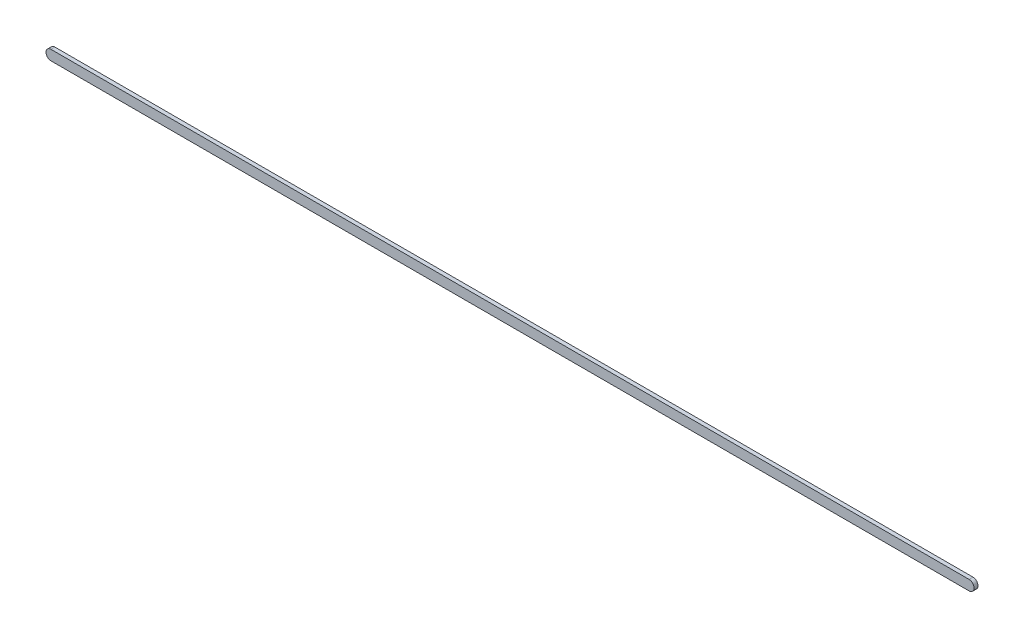
ISO-10303-21;
HEADER;
FILE_DESCRIPTION(('STEP AP214'),'2;1');
FILE_NAME('part.step','',(''),(''),'','','');
FILE_SCHEMA(('AUTOMOTIVE_DESIGN { 1 0 10303 214 1 1 1 1 }'));
ENDSEC;
DATA;
#1=APPLICATION_CONTEXT('core data for automotive mechanical design processes');
#2=APPLICATION_PROTOCOL_DEFINITION('international standard','automotive_design',2000,#1);
#3=PRODUCT_CONTEXT('',#1,'mechanical');
#4=PRODUCT('Part','Part','',(#3));
#5=PRODUCT_RELATED_PRODUCT_CATEGORY('part','',(#4));
#6=PRODUCT_DEFINITION_FORMATION('','',#4);
#7=PRODUCT_DEFINITION_CONTEXT('part definition',#1,'design');
#8=PRODUCT_DEFINITION('design','',#6,#7);
#9=PRODUCT_DEFINITION_SHAPE('','',#8);
#10=(LENGTH_UNIT() NAMED_UNIT(*) SI_UNIT(.MILLI.,.METRE.));
#11=(NAMED_UNIT(*) PLANE_ANGLE_UNIT() SI_UNIT($,.RADIAN.));
#12=(NAMED_UNIT(*) SI_UNIT($,.STERADIAN.) SOLID_ANGLE_UNIT());
#13=UNCERTAINTY_MEASURE_WITH_UNIT(LENGTH_MEASURE(1.E-05),#10,'distance_accuracy_value','');
#14=(GEOMETRIC_REPRESENTATION_CONTEXT(3) GLOBAL_UNCERTAINTY_ASSIGNED_CONTEXT((#13)) GLOBAL_UNIT_ASSIGNED_CONTEXT((#10,
#11,#12)) REPRESENTATION_CONTEXT('',''));
#15=CARTESIAN_POINT('',(0.,0.,0.));
#16=DIRECTION('',(0.,0.,1.));
#17=DIRECTION('',(1.,0.,0.));
#18=AXIS2_PLACEMENT_3D('',#15,#16,#17);
#19=CARTESIAN_POINT('',(105.41,51.435,0.));
#20=DIRECTION('',(0.,1.,0.));
#21=DIRECTION('',(1.,0.,0.));
#22=AXIS2_PLACEMENT_3D('',#19,#20,#21);
#23=PLANE('',#22);
#24=DIRECTION('',(1.,0.,0.));
#25=VECTOR('',#24,1.);
#26=CARTESIAN_POINT('',(105.41,51.435,0.1999996));
#27=LINE('',#26,#25);
#28=CARTESIAN_POINT('',(105.41,51.435,0.1999996));
#29=VERTEX_POINT('',#28);
#30=CARTESIAN_POINT('',(152.1206,51.435,0.1999996));
#31=VERTEX_POINT('',#30);
#32=EDGE_CURVE('E11',#29,#31,#27,.T.);
#33=ORIENTED_EDGE('',*,*,#32,.F.);
#34=DIRECTION('',(0.,0.,1.));
#35=VECTOR('',#34,1.);
#36=CARTESIAN_POINT('',(105.41,51.435,0.));
#37=LINE('',#36,#35);
#38=CARTESIAN_POINT('',(105.41,51.435,0.));
#39=VERTEX_POINT('',#38);
#40=EDGE_CURVE('E24',#39,#29,#37,.T.);
#41=ORIENTED_EDGE('',*,*,#40,.F.);
#42=DIRECTION('',(1.,0.,0.));
#43=VECTOR('',#42,1.);
#44=CARTESIAN_POINT('',(105.41,51.435,0.));
#45=LINE('',#44,#43);
#46=CARTESIAN_POINT('',(152.1206,51.435,0.));
#47=VERTEX_POINT('',#46);
#48=EDGE_CURVE('E75',#39,#47,#45,.T.);
#49=ORIENTED_EDGE('',*,*,#48,.T.);
#50=DIRECTION('',(0.,0.,1.));
#51=VECTOR('',#50,1.);
#52=CARTESIAN_POINT('',(152.1206,51.435,0.));
#53=LINE('',#52,#51);
#54=EDGE_CURVE('E37',#47,#31,#53,.T.);
#55=ORIENTED_EDGE('',*,*,#54,.T.);
#56=EDGE_LOOP('',(#33,#41,#49,#55));
#57=FACE_BOUND('',#56,.T.);
#58=ADVANCED_FACE('F17',(#57),#23,.F.);
#59=CARTESIAN_POINT('',(152.1206,51.689,0.));
#60=DIRECTION('',(0.,0.,-1.));
#61=DIRECTION('',(1.11896493820489E-13,-1.,0.));
#62=AXIS2_PLACEMENT_3D('',#59,#60,#61);
#63=CYLINDRICAL_SURFACE('',#62,0.254000000000005);
#64=CARTESIAN_POINT('',(152.1206,51.689,0.1999996));
#65=DIRECTION('',(0.,0.,1.));
#66=DIRECTION('',(1.11896493820489E-13,-1.,0.));
#67=AXIS2_PLACEMENT_3D('',#64,#65,#66);
#68=CIRCLE('',#67,0.254000000000005);
#69=CARTESIAN_POINT('',(152.1206,51.943,0.1999996));
#70=VERTEX_POINT('',#69);
#71=EDGE_CURVE('E83',#31,#70,#68,.T.);
#72=ORIENTED_EDGE('',*,*,#71,.F.);
#73=ORIENTED_EDGE('',*,*,#54,.F.);
#74=CARTESIAN_POINT('',(152.1206,51.689,0.));
#75=DIRECTION('',(0.,0.,1.));
#76=DIRECTION('',(1.11896493820489E-13,-1.,0.));
#77=AXIS2_PLACEMENT_3D('',#74,#75,#76);
#78=CIRCLE('',#77,0.254000000000005);
#79=CARTESIAN_POINT('',(152.1206,51.943,0.));
#80=VERTEX_POINT('',#79);
#81=EDGE_CURVE('E81',#47,#80,#78,.T.);
#82=ORIENTED_EDGE('',*,*,#81,.T.);
#83=DIRECTION('',(0.,0.,1.));
#84=VECTOR('',#83,1.);
#85=CARTESIAN_POINT('',(152.1206,51.943,0.));
#86=LINE('',#85,#84);
#87=EDGE_CURVE('E67',#80,#70,#86,.T.);
#88=ORIENTED_EDGE('',*,*,#87,.T.);
#89=EDGE_LOOP('',(#72,#73,#82,#88));
#90=FACE_BOUND('',#89,.T.);
#91=ADVANCED_FACE('F89',(#90),#63,.T.);
#92=CARTESIAN_POINT('',(152.1206,51.943,0.));
#93=DIRECTION('',(0.,-1.,0.));
#94=DIRECTION('',(-1.,0.,0.));
#95=AXIS2_PLACEMENT_3D('',#92,#93,#94);
#96=PLANE('',#95);
#97=DIRECTION('',(-1.,0.,0.));
#98=VECTOR('',#97,1.);
#99=CARTESIAN_POINT('',(152.1206,51.943,0.1999996));
#100=LINE('',#99,#98);
#101=CARTESIAN_POINT('',(105.41,51.943,0.1999996));
#102=VERTEX_POINT('',#101);
#103=EDGE_CURVE('E71',#70,#102,#100,.T.);
#104=ORIENTED_EDGE('',*,*,#103,.F.);
#105=ORIENTED_EDGE('',*,*,#87,.F.);
#106=DIRECTION('',(-1.,0.,0.));
#107=VECTOR('',#106,1.);
#108=CARTESIAN_POINT('',(152.1206,51.943,0.));
#109=LINE('',#108,#107);
#110=CARTESIAN_POINT('',(105.41,51.943,0.));
#111=VERTEX_POINT('',#110);
#112=EDGE_CURVE('E63',#80,#111,#109,.T.);
#113=ORIENTED_EDGE('',*,*,#112,.T.);
#114=DIRECTION('',(0.,0.,1.));
#115=VECTOR('',#114,1.);
#116=CARTESIAN_POINT('',(105.41,51.943,0.));
#117=LINE('',#116,#115);
#118=EDGE_CURVE('E53',#111,#102,#117,.T.);
#119=ORIENTED_EDGE('',*,*,#118,.T.);
#120=EDGE_LOOP('',(#104,#105,#113,#119));
#121=FACE_BOUND('',#120,.T.);
#122=ADVANCED_FACE('F66',(#121),#96,.F.);
#123=CARTESIAN_POINT('',(105.41,51.689,0.));
#124=DIRECTION('',(0.,0.,-1.));
#125=DIRECTION('',(0.,1.,0.));
#126=AXIS2_PLACEMENT_3D('',#123,#124,#125);
#127=CYLINDRICAL_SURFACE('',#126,0.254);
#128=CARTESIAN_POINT('',(105.41,51.689,0.1999996));
#129=DIRECTION('',(0.,0.,1.));
#130=DIRECTION('',(0.,1.,0.));
#131=AXIS2_PLACEMENT_3D('',#128,#129,#130);
#132=CIRCLE('',#131,0.254);
#133=EDGE_CURVE('E59',#102,#29,#132,.T.);
#134=ORIENTED_EDGE('',*,*,#133,.F.);
#135=ORIENTED_EDGE('',*,*,#118,.F.);
#136=CARTESIAN_POINT('',(105.41,51.689,0.));
#137=DIRECTION('',(0.,0.,1.));
#138=DIRECTION('',(0.,1.,0.));
#139=AXIS2_PLACEMENT_3D('',#136,#137,#138);
#140=CIRCLE('',#139,0.254);
#141=EDGE_CURVE('E57',#111,#39,#140,.T.);
#142=ORIENTED_EDGE('',*,*,#141,.T.);
#143=ORIENTED_EDGE('',*,*,#40,.T.);
#144=EDGE_LOOP('',(#134,#135,#142,#143));
#145=FACE_BOUND('',#144,.T.);
#146=ADVANCED_FACE('F55',(#145),#127,.T.);
#147=CARTESIAN_POINT('',(105.41,51.435,0.));
#148=DIRECTION('',(0.,0.,-1.));
#149=DIRECTION('',(-1.,0.,0.));
#150=AXIS2_PLACEMENT_3D('',#147,#148,#149);
#151=PLANE('',#150);
#152=ORIENTED_EDGE('',*,*,#141,.F.);
#153=ORIENTED_EDGE('',*,*,#112,.F.);
#154=ORIENTED_EDGE('',*,*,#81,.F.);
#155=ORIENTED_EDGE('',*,*,#48,.F.);
#156=EDGE_LOOP('',(#152,#153,#154,#155));
#157=FACE_BOUND('',#156,.T.);
#158=ADVANCED_FACE('F74',(#157),#151,.T.);
#159=CARTESIAN_POINT('',(105.41,51.435,0.1999996));
#160=DIRECTION('',(0.,0.,-1.));
#161=DIRECTION('',(-1.,0.,0.));
#162=AXIS2_PLACEMENT_3D('',#159,#160,#161);
#163=PLANE('',#162);
#164=ORIENTED_EDGE('',*,*,#32,.T.);
#165=ORIENTED_EDGE('',*,*,#71,.T.);
#166=ORIENTED_EDGE('',*,*,#103,.T.);
#167=ORIENTED_EDGE('',*,*,#133,.T.);
#168=EDGE_LOOP('',(#164,#165,#166,#167));
#169=FACE_BOUND('',#168,.T.);
#170=ADVANCED_FACE('F91',(#169),#163,.F.);
#171=CLOSED_SHELL('',(#58,#91,#122,#146,#158,#170));
#172=MANIFOLD_SOLID_BREP('B1',#171);
#173=ADVANCED_BREP_SHAPE_REPRESENTATION('',(#18,#172),#14);
#174=SHAPE_DEFINITION_REPRESENTATION(#9,#173);
ENDSEC;
END-ISO-10303-21;
